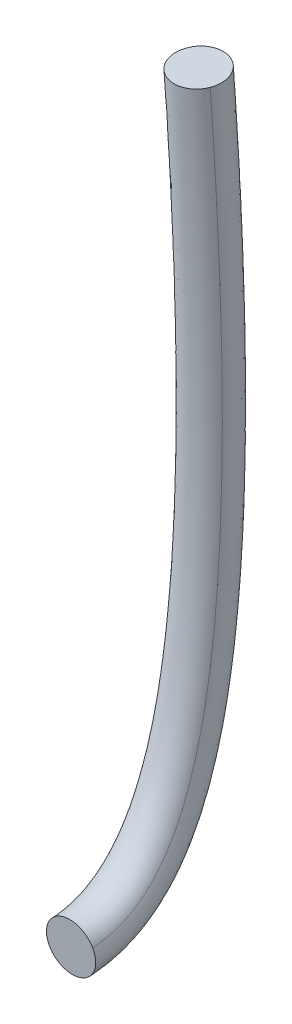
ISO-10303-21;
HEADER;
FILE_DESCRIPTION(('STEP AP214'),'2;1');
FILE_NAME('part.step','',(''),(''),'','','');
FILE_SCHEMA(('AUTOMOTIVE_DESIGN { 1 0 10303 214 1 1 1 1 }'));
ENDSEC;
DATA;
#1=APPLICATION_CONTEXT('core data for automotive mechanical design processes');
#2=APPLICATION_PROTOCOL_DEFINITION('international standard','automotive_design',2000,#1);
#3=PRODUCT_CONTEXT('',#1,'mechanical');
#4=PRODUCT('Part','Part','',(#3));
#5=PRODUCT_RELATED_PRODUCT_CATEGORY('part','',(#4));
#6=PRODUCT_DEFINITION_FORMATION('','',#4);
#7=PRODUCT_DEFINITION_CONTEXT('part definition',#1,'design');
#8=PRODUCT_DEFINITION('design','',#6,#7);
#9=PRODUCT_DEFINITION_SHAPE('','',#8);
#10=(LENGTH_UNIT() NAMED_UNIT(*) SI_UNIT(.MILLI.,.METRE.));
#11=(NAMED_UNIT(*) PLANE_ANGLE_UNIT() SI_UNIT($,.RADIAN.));
#12=(NAMED_UNIT(*) SI_UNIT($,.STERADIAN.) SOLID_ANGLE_UNIT());
#13=UNCERTAINTY_MEASURE_WITH_UNIT(LENGTH_MEASURE(1.E-05),#10,'distance_accuracy_value','');
#14=(GEOMETRIC_REPRESENTATION_CONTEXT(3) GLOBAL_UNCERTAINTY_ASSIGNED_CONTEXT((#13)) GLOBAL_UNIT_ASSIGNED_CONTEXT((#10,
#11,#12)) REPRESENTATION_CONTEXT('',''));
#15=CARTESIAN_POINT('',(0.,0.,0.));
#16=DIRECTION('',(0.,0.,1.));
#17=DIRECTION('',(1.,0.,0.));
#18=AXIS2_PLACEMENT_3D('',#15,#16,#17);
#19=CARTESIAN_POINT('',(2.74287605735283,-7.28809495488645,11.1726740101474));
#20=CARTESIAN_POINT('',(2.74287605735293,-7.28391227196276,11.0968550295844));
#21=CARTESIAN_POINT('',(2.74287605735307,-7.25716087085845,10.9541601878726));
#22=CARTESIAN_POINT('',(2.74287605735321,-7.13144865063385,10.6996029535221));
#23=CARTESIAN_POINT('',(2.7428760573531,-6.82482429921507,10.4240605016951));
#24=CARTESIAN_POINT('',(2.74287605735272,-6.16587122921789,10.1770932302241));
#25=CARTESIAN_POINT('',(2.74287605735222,-5.06029404172376,10.0061294862398));
#26=CARTESIAN_POINT('',(2.74287605735193,-3.38304927418693,9.96226684328779));
#27=CARTESIAN_POINT('',(2.74287605735239,-1.84087281979093,10.0365898659036));
#28=CARTESIAN_POINT('',(2.74287605735284,-1.0071197427742,10.097483370663));
#29=CARTESIAN_POINT('',(2.71375298184655,-7.22774566346305,11.1760032813776));
#30=CARTESIAN_POINT('',(2.71375298184665,-7.22383959943697,11.1051985376584));
#31=CARTESIAN_POINT('',(2.71375298184679,-7.19892516458884,10.9732427536788));
#32=CARTESIAN_POINT('',(2.71375298184693,-7.08368767800574,10.7396382142415));
#33=CARTESIAN_POINT('',(2.71375298184683,-6.79660405759646,10.4790045068828));
#34=CARTESIAN_POINT('',(2.71375298184644,-6.15267979847719,10.2363565523745));
#35=CARTESIAN_POINT('',(2.71375298184594,-5.05654346644841,10.0666567173344));
#36=CARTESIAN_POINT('',(2.71375298184565,-3.38434558742928,10.0227007328809));
#37=CARTESIAN_POINT('',(2.71375298184611,-1.84433494757116,10.0969390491669));
#38=CARTESIAN_POINT('',(2.71375298184656,-1.01152235391902,10.1577638653303));
#39=CARTESIAN_POINT('',(2.61201654344571,-7.14685068979496,11.1804659900879));
#40=CARTESIAN_POINT('',(2.6120165434458,-7.14331541171522,11.1163824377601));
#41=CARTESIAN_POINT('',(2.61201654344595,-7.12086343470429,10.9988217356804));
#42=CARTESIAN_POINT('',(2.61201654344609,-7.01966659159559,10.7933027869987));
#43=CARTESIAN_POINT('',(2.61201654344598,-6.75877621273556,10.5526535158968));
#44=CARTESIAN_POINT('',(2.6120165434456,-6.13499718862752,10.3157955440014));
#45=CARTESIAN_POINT('',(2.6120165434451,-5.05151588015773,10.1477900450127));
#46=CARTESIAN_POINT('',(2.61201654344481,-3.3860830857693,10.1037090252011));
#47=CARTESIAN_POINT('',(2.61201654344527,-1.84897576638812,10.1778338761681));
#48=CARTESIAN_POINT('',(2.61201654344571,-1.01742381695577,10.2385666206535));
#49=CARTESIAN_POINT('',(2.43452528876107,-7.16764514411101,11.1793188286734));
#50=CARTESIAN_POINT('',(2.43452528876116,-7.16401424203855,11.1135019119532));
#51=CARTESIAN_POINT('',(2.43452528876131,-7.14093403547936,10.9922387510038));
#52=CARTESIAN_POINT('',(2.43452528876145,-7.0361200440977,10.7794833584237));
#53=CARTESIAN_POINT('',(2.43452528876134,-6.7684940098246,10.5337000924034));
#54=CARTESIAN_POINT('',(2.43452528876096,-6.13953304957484,10.2953616309002));
#55=CARTESIAN_POINT('',(2.43452528876046,-5.0528017121965,10.1269267608778));
#56=CARTESIAN_POINT('',(2.43452528876017,-3.38563003354926,10.0828817367743));
#57=CARTESIAN_POINT('',(2.43452528876063,-1.84778388039093,10.1570393821722));
#58=CARTESIAN_POINT('',(2.43452528876108,-1.01590681660384,10.2177958715205));
#59=CARTESIAN_POINT('',(2.33405926185312,-7.26777318936752,11.1737950948804));
#60=CARTESIAN_POINT('',(2.33405926185321,-7.26368423802673,11.09967517523));
#61=CARTESIAN_POINT('',(2.33405926185336,-7.23754249192168,10.9606005539792));
#62=CARTESIAN_POINT('',(2.3340592618535,-7.11537235533315,10.7131305250554));
#63=CARTESIAN_POINT('',(2.33405926185339,-6.81533285191102,10.4426025636238));
#64=CARTESIAN_POINT('',(2.33405926185301,-6.16144708716404,10.1970750390796));
#65=CARTESIAN_POINT('',(2.33405926185251,-5.05904333594246,10.0265253402023));
#66=CARTESIAN_POINT('',(2.33405926185222,-3.38349782207332,9.98262404057894));
#67=CARTESIAN_POINT('',(2.33405926185268,-1.8420366561696,10.0569117400428));
#68=CARTESIAN_POINT('',(2.33405926185312,-1.00860225945721,10.1177819698528));
#69=CARTESIAN_POINT('',(2.31500000000068,-7.35208061372048,11.1691441325282));
#70=CARTESIAN_POINT('',(2.31500000000077,-7.34760369485504,11.0879915731232));
#71=CARTESIAN_POINT('',(2.31500000000092,-7.31891913266023,10.9339040945914));
#72=CARTESIAN_POINT('',(2.31500000000105,-7.18207685997886,10.6570801619975));
#73=CARTESIAN_POINT('',(2.31500000000094,-6.85472656792234,10.3657400882673));
#74=CARTESIAN_POINT('',(2.31500000000056,-6.17982844834647,10.1142171632709));
#75=CARTESIAN_POINT('',(2.31500000000007,-5.06425070540274,9.94193213737854));
#76=CARTESIAN_POINT('',(2.31499999999978,-3.38165529554353,9.89818020262244));
#77=CARTESIAN_POINT('',(2.31500000000023,-1.83720530777411,9.97260408602737));
#78=CARTESIAN_POINT('',(2.31500000000068,-1.00245185077312,10.0335706539573));
#79=CARTESIAN_POINT('',(2.315,-7.38568943191456,11.1672900449514));
#80=CARTESIAN_POINT('',(2.31500000000009,-7.3810594674981,11.0833632476063));
#81=CARTESIAN_POINT('',(2.31500000000024,-7.35133654868749,10.9233020086195));
#82=CARTESIAN_POINT('',(2.31500000000037,-7.2086864203845,10.6348639242625));
#83=CARTESIAN_POINT('',(2.31500000000026,-6.87046203039657,10.3352110893052));
#84=CARTESIAN_POINT('',(2.31499999999988,-6.18720558950165,10.0812573886417));
#85=CARTESIAN_POINT('',(2.31499999999939,-5.06636048889751,9.9082486010761));
#86=CARTESIAN_POINT('',(2.3149999999991,-3.3809540733158,9.86453621851609));
#87=CARTESIAN_POINT('',(2.31499999999955,-1.83527381521949,9.93899557759439));
#88=CARTESIAN_POINT('',(2.315,-1.00000001490137,10.0000001490162));
#89=B_SPLINE_SURFACE_WITH_KNOTS('',3,3,((#19,#20,#21,#22,#23,#24,#25,#26,#27,#28),(#29,#30,#31,
#32,#33,#34,#35,#36,#37,#38),(#39,#40,#41,#42,#43,#44,#45,#46,#47,#48),(#49,#50,#51,#52,#53,#54,
#55,#56,#57,#58),(#59,#60,#61,#62,#63,#64,#65,#66,#67,#68),(#69,#70,#71,#72,#73,#74,#75,#76,#77,
#78),(#79,#80,#81,#82,#83,#84,#85,#86,#87,#88)),.UNSPECIFIED.,.F.,.F.,.F.,(4,1,1,1,4),(4,1,1,1,
1,1,1,4),(0.448798950512828,1.34639685153848,2.01959527730772,2.69279370307697,
3.14159265358979),(0.,0.0714285714285714,0.142857142857143,0.285714285714286,0.428571428571429,
0.571428571428571,0.785714285714286,1.),.UNSPECIFIED.);
#90=CARTESIAN_POINT('',(2.315,-7.38568943191456,11.1672900449514));
#91=CARTESIAN_POINT('',(2.31500000000009,-7.3810594674981,11.0833632476063));
#92=CARTESIAN_POINT('',(2.31500000000024,-7.35133654868749,10.9233020086195));
#93=CARTESIAN_POINT('',(2.31500000000037,-7.2086864203845,10.6348639242625));
#94=CARTESIAN_POINT('',(2.31500000000026,-6.87046203039657,10.3352110893052));
#95=CARTESIAN_POINT('',(2.31499999999988,-6.18720558950165,10.0812573886417));
#96=CARTESIAN_POINT('',(2.31499999999939,-5.06636048889751,9.9082486010761));
#97=CARTESIAN_POINT('',(2.3149999999991,-3.3809540733158,9.86453621851609));
#98=CARTESIAN_POINT('',(2.31499999999955,-1.83527381521949,9.93899557759439));
#99=CARTESIAN_POINT('',(2.315,-1.00000001490137,10.0000001490162));
#100=B_SPLINE_CURVE_WITH_KNOTS('',3,(#90,#91,#92,#93,#94,#95,#96,#97,#98,#99),.UNSPECIFIED.,.F.,
.F.,(4,1,1,1,1,1,1,4),(0.,0.0714285714285714,0.142857142857143,0.285714285714286,
0.428571428571429,0.571428571428571,0.785714285714286,1.),.UNSPECIFIED.);
#101=CARTESIAN_POINT('',(2.315,-7.38568943191456,11.1672900449514));
#102=VERTEX_POINT('',#101);
#103=CARTESIAN_POINT('',(2.315,-1.00000001490137,10.0000001490162));
#104=VERTEX_POINT('',#103);
#105=EDGE_CURVE('E11',#102,#104,#100,.T.);
#106=CARTESIAN_POINT('',(2.315,-7.38568943191456,11.1672900449514));
#107=CARTESIAN_POINT('',(2.31500896470411,-7.39838166282353,11.1665898564618));
#108=CARTESIAN_POINT('',(2.31613100551139,-7.41108389469456,11.165889116252));
#109=CARTESIAN_POINT('',(2.32051228064609,-7.43613079110765,11.164507361642));
#110=CARTESIAN_POINT('',(2.32377581095085,-7.44847468471064,11.1638263897719));
#111=CARTESIAN_POINT('',(2.33228061852872,-7.47243526517356,11.1625045636276));
#112=CARTESIAN_POINT('',(2.33751786725331,-7.48405337748824,11.1618636307158));
#113=CARTESIAN_POINT('',(2.34983606433673,-7.50626256508225,11.1606384231357));
#114=CARTESIAN_POINT('',(2.35691595280953,-7.51685422598549,11.1600541161605));
#115=CARTESIAN_POINT('',(2.37289496100922,-7.53686096123792,11.1589504106072));
#116=CARTESIAN_POINT('',(2.3818216779409,-7.54625421078487,11.1584322160313));
#117=CARTESIAN_POINT('',(2.40122545622583,-7.56327215581114,11.1574933921704));
#118=CARTESIAN_POINT('',(2.41170163586845,-7.57089785081041,11.1570727077453));
#119=CARTESIAN_POINT('',(2.43322713426298,-7.58383505178018,11.1563590050659));
#120=CARTESIAN_POINT('',(2.44421540104035,-7.58924889619143,11.1560603411377));
#121=CARTESIAN_POINT('',(2.46691929446208,-7.59828673864571,11.1555617531981));
#122=CARTESIAN_POINT('',(2.47863580639159,-7.60190850829943,11.1553619521196));
#123=CARTESIAN_POINT('',(2.50315491083756,-7.60743380892634,11.1550571395198));
#124=CARTESIAN_POINT('',(2.51598169604064,-7.60923087119134,11.1549580015258));
#125=CARTESIAN_POINT('',(2.5417442628634,-7.61065932694018,11.1548791983366));
#126=CARTESIAN_POINT('',(2.55467988211084,-7.61029351755997,11.1548993788328));
#127=CARTESIAN_POINT('',(2.58025398552993,-7.607270363485,11.1550661562655));
#128=CARTESIAN_POINT('',(2.59289314364588,-7.60461886819262,11.1552124305098));
#129=CARTESIAN_POINT('',(2.61749001072985,-7.59709053291747,11.1556277439203));
#130=CARTESIAN_POINT('',(2.62944733196087,-7.59221244066673,11.15589685217));
#131=CARTESIAN_POINT('',(2.65178992279654,-7.58083357136503,11.1565245868345));
#132=CARTESIAN_POINT('',(2.66222415088748,-7.5744275543554,11.1568779856505));
#133=CARTESIAN_POINT('',(2.68197588188152,-7.56007325918947,11.1576698647397));
#134=CARTESIAN_POINT('',(2.69129273830489,-7.55212409510955,11.1581083938864));
#135=CARTESIAN_POINT('',(2.70922251448865,-7.53420782772129,11.1590967752272));
#136=CARTESIAN_POINT('',(2.71772914454914,-7.52413366902927,11.1596525333134));
#137=CARTESIAN_POINT('',(2.73281061039976,-7.50266260680048,11.1608370209532));
#138=CARTESIAN_POINT('',(2.73938838420447,-7.49126775226711,11.16146563747));
#139=CARTESIAN_POINT('',(2.75513021216507,-7.4568167930145,11.1633661831896));
#140=CARTESIAN_POINT('',(2.7614225848679,-7.43237335938177,11.1647146467497));
#141=CARTESIAN_POINT('',(2.76492493850227,-7.39526665219774,11.1667617013176));
#142=CARTESIAN_POINT('',(2.76508784607549,-7.38275680710809,11.1674518281836));
#143=CARTESIAN_POINT('',(2.76342160852836,-7.35785564060767,11.1688255433553));
#144=CARTESIAN_POINT('',(2.76159355238563,-7.34546425814048,11.1695091350293));
#145=CARTESIAN_POINT('',(2.7557848398338,-7.32053527520921,11.1708843847417));
#146=CARTESIAN_POINT('',(2.75170126270715,-7.3080212651594,11.1715747413747));
#147=CARTESIAN_POINT('',(2.74127730051706,-7.28397088048399,11.1729015217211));
#148=CARTESIAN_POINT('',(2.734938276883,-7.27243392128198,11.1735379776835));
#149=CARTESIAN_POINT('',(2.72083725755737,-7.2514689821293,11.1746945441836));
#150=CARTESIAN_POINT('',(2.71321084157737,-7.24194891279311,11.1752197349887));
#151=CARTESIAN_POINT('',(2.69654904691985,-7.22421070217572,11.176198293525));
#152=CARTESIAN_POINT('',(2.68751186883148,-7.21599425101121,11.176651568018));
#153=CARTESIAN_POINT('',(2.6676970396013,-7.20061313947346,11.1775000931775));
#154=CARTESIAN_POINT('',(2.6568477955983,-7.19354023624107,11.1778902819054));
#155=CARTESIAN_POINT('',(2.63413175675102,-7.18130338431704,11.1785653486393));
#156=CARTESIAN_POINT('',(2.62226637097625,-7.17613684326487,11.1788503696574));
#157=CARTESIAN_POINT('',(2.59779822918427,-7.16798739539909,11.1792999477996));
#158=CARTESIAN_POINT('',(2.58519544182267,-7.16500458148112,11.179464499799));
#159=CARTESIAN_POINT('',(2.55965145093931,-7.16133307914383,11.1796670444654));
#160=CARTESIAN_POINT('',(2.54670993174335,-7.16064661347473,11.1797049145107));
#161=CARTESIAN_POINT('',(2.52153220492211,-7.16143909500405,11.1796611959202));
#162=CARTESIAN_POINT('',(2.50929231770947,-7.16281430619186,11.1795853300578));
#163=CARTESIAN_POINT('',(2.48519235967198,-7.16748799379907,11.1793274981376));
#164=CARTESIAN_POINT('',(2.47333204265383,-7.17078519578465,11.1791456023861));
#165=CARTESIAN_POINT('',(2.44975912516828,-7.17948603718426,11.1786656056824));
#166=CARTESIAN_POINT('',(2.43808075272045,-7.18498292605269,11.1783623604656));
#167=CARTESIAN_POINT('',(2.41585364168293,-7.19791998560312,11.1776486655878));
#168=CARTESIAN_POINT('',(2.40530554287644,-7.20536124877596,11.1772381556577));
#169=CARTESIAN_POINT('',(2.38584476278662,-7.22169799174513,11.1763369114661));
#170=CARTESIAN_POINT('',(2.37689883574048,-7.23055416945654,11.1758483453708));
#171=CARTESIAN_POINT('',(2.3605771048414,-7.24960785642885,11.1747972163456));
#172=CARTESIAN_POINT('',(2.35320085366327,-7.25980498220336,11.1742346745713));
#173=CARTESIAN_POINT('',(2.34015539251321,-7.28152384802917,11.1730365164249));
#174=CARTESIAN_POINT('',(2.33452420177907,-7.29306842348802,11.1723996402987));
#175=CARTESIAN_POINT('',(2.32535174436188,-7.3169487978667,11.1710822388594));
#176=CARTESIAN_POINT('',(2.32180877535467,-7.32928394319032,11.1704017496029));
#177=CARTESIAN_POINT('',(2.31789278038603,-7.34903922173863,11.169311916086));
#178=CARTESIAN_POINT('',(2.31681270377974,-7.35632789552673,11.1689098240087));
#179=CARTESIAN_POINT('',(2.31536387505372,-7.37097309067819,11.1681018969274));
#180=CARTESIAN_POINT('',(2.31499480163131,-7.37832957988485,11.1676960636973));
#181=CARTESIAN_POINT('',(2.315,-7.38568943191456,11.1672900449514));
#182=B_SPLINE_CURVE_WITH_KNOTS('',3,(#106,#107,#108,#109,#110,#111,#112,#113,#114,#115,#116,
#117,#118,#119,#120,#121,#122,#123,#124,#125,#126,#127,#128,#129,#130,#131,#132,#133,#134,#135,
#136,#137,#138,#139,#140,#141,#142,#143,#144,#145,#146,#147,#148,#149,#150,#151,#152,#153,#154,
#155,#156,#157,#158,#159,#160,#161,#162,#163,#164,#165,#166,#167,#168,#169,#170,#171,#172,#173,
#174,#175,#176,#177,#178,#179,#180,#181),.UNSPECIFIED.,.T.,.F.,(4,2,2,2,2,2,2,2,2,2,2,2,2,2,2,2,
2,2,2,2,2,2,2,2,2,2,2,2,2,2,2,2,2,2,2,2,2,4),(0.,0.0381078075710447,0.0762922967376633,
0.114399266145828,0.152484364689622,0.191186051482009,0.229865799489612,0.266466979749708,
0.303113558777578,0.341793167441405,0.380422764612928,0.418953795528113,0.457506523563608,
0.494105523550739,0.530725597564658,0.570111078224461,0.609436251926878,0.683601793868497,
0.721083150779048,0.758544017175621,0.797875280656622,0.837182843221715,0.873655816171898,
0.910175695921471,0.94887007908257,0.987511648178638,1.02615486098964,1.06483546769083,
1.10163401558086,1.13840819079796,1.1769421288077,1.21549776471737,1.25312562421717,
1.29074274615157,1.32912961533753,1.3674851480036,1.38959273945398,1.41169033812761),.UNSPECIFIED.);
#183=CARTESIAN_POINT('',(2.74287605735283,-7.28809495488645,11.1726740101474));
#184=VERTEX_POINT('',#183);
#185=EDGE_CURVE('E45',#184,#102,#182,.T.);
#186=CARTESIAN_POINT('',(2.74287605735283,-7.28809495488645,11.1726740101474));
#187=CARTESIAN_POINT('',(2.74287605735293,-7.28391227196276,11.0968550295844));
#188=CARTESIAN_POINT('',(2.74287605735307,-7.25716087085845,10.9541601878726));
#189=CARTESIAN_POINT('',(2.74287605735321,-7.13144865063385,10.6996029535221));
#190=CARTESIAN_POINT('',(2.7428760573531,-6.82482429921507,10.4240605016951));
#191=CARTESIAN_POINT('',(2.74287605735272,-6.16587122921789,10.1770932302241));
#192=CARTESIAN_POINT('',(2.74287605735222,-5.06029404172376,10.0061294862398));
#193=CARTESIAN_POINT('',(2.74287605735193,-3.38304927418693,9.96226684328779));
#194=CARTESIAN_POINT('',(2.74287605735239,-1.84087281979093,10.0365898659036));
#195=CARTESIAN_POINT('',(2.74287605735284,-1.0071197427742,10.097483370663));
#196=B_SPLINE_CURVE_WITH_KNOTS('',3,(#186,#187,#188,#189,#190,#191,#192,#193,#194,#195),
.UNSPECIFIED.,.F.,.F.,(4,1,1,1,1,1,1,4),(0.,0.0714285714285714,0.142857142857143,
0.285714285714286,0.428571428571429,0.571428571428571,0.785714285714286,1.),.UNSPECIFIED.);
#197=CARTESIAN_POINT('',(2.74287605735284,-1.00711974277419,10.097483370663));
#198=VERTEX_POINT('',#197);
#199=EDGE_CURVE('E29',#184,#198,#196,.T.);
#200=CARTESIAN_POINT('',(2.315,-1.00000001490137,10.0000001490162));
#201=CARTESIAN_POINT('',(2.31498688264654,-1.00091767570766,10.0125647488685));
#202=CARTESIAN_POINT('',(2.3160644899023,-1.00183518530814,10.0251272784127));
#203=CARTESIAN_POINT('',(2.32026710672092,-1.00364587816514,10.0499192615152));
#204=CARTESIAN_POINT('',(2.32339428631161,-1.00453903459206,10.0621483477231));
#205=CARTESIAN_POINT('',(2.33167943386356,-1.00627463903436,10.085912221226));
#206=CARTESIAN_POINT('',(2.33683805377311,-1.0071170706705,10.0974467842568));
#207=CARTESIAN_POINT('',(2.34906582527119,-1.00872462325738,10.1194573734168));
#208=CARTESIAN_POINT('',(2.35613498177814,-1.00948974400907,10.1299333968208));
#209=CARTESIAN_POINT('',(2.37182104233748,-1.01091686644703,10.1494735387231));
#210=CARTESIAN_POINT('',(2.38042083559858,-1.0115798706356,10.1585513834698));
#211=CARTESIAN_POINT('',(2.39897995654105,-1.01279546917028,10.175195342833));
#212=CARTESIAN_POINT('',(2.40893881064082,-1.0133481018122,10.1827619817952));
#213=CARTESIAN_POINT('',(2.43028976683374,-1.014338952735,10.1963286997728));
#214=CARTESIAN_POINT('',(2.44171490263472,-1.01477341470933,10.2022773474877));
#215=CARTESIAN_POINT('',(2.46543241312504,-1.01549134220434,10.2121072014335));
#216=CARTESIAN_POINT('',(2.47772534366353,-1.01577470993232,10.215987068688));
#217=CARTESIAN_POINT('',(2.50251044581548,-1.016183971731,10.2215906759248));
#218=CARTESIAN_POINT('',(2.51499251785176,-1.01631314705339,10.2233593427627));
#219=CARTESIAN_POINT('',(2.54007381789078,-1.0164210725651,10.2248370574685));
#220=CARTESIAN_POINT('',(2.55267295657383,-1.01639992932041,10.2245475644365));
#221=CARTESIAN_POINT('',(2.57787765452609,-1.01619851338773,10.2217897800996));
#222=CARTESIAN_POINT('',(2.59047884083512,-1.01601524280578,10.2192804416693));
#223=CARTESIAN_POINT('',(2.61502795897059,-1.01548781439569,10.2120588987221));
#224=CARTESIAN_POINT('',(2.62697575935624,-1.01514362432761,10.2073462527762));
#225=CARTESIAN_POINT('',(2.64942570920422,-1.01433304451268,10.196247804468));
#226=CARTESIAN_POINT('',(2.65996761323762,-1.0138724332794,10.1899411214386));
#227=CARTESIAN_POINT('',(2.67994330074826,-1.01283677759848,10.1757609372938));
#228=CARTESIAN_POINT('',(2.68937623847494,-1.0122616467016,10.1678862525167));
#229=CARTESIAN_POINT('',(2.70750194311374,-1.01096627142121,10.1501499909861));
#230=CARTESIAN_POINT('',(2.7160967051316,-1.0102386881272,10.1401879299654));
#231=CARTESIAN_POINT('',(2.73138782283397,-1.00868655101777,10.1189360888032));
#232=CARTESIAN_POINT('',(2.73808708835751,-1.00786214861635,10.1076483818204));
#233=CARTESIAN_POINT('',(2.75428709755926,-1.0053556693608,10.0733297003773));
#234=CARTESIAN_POINT('',(2.76089789690931,-1.00356842886585,10.0488588267114));
#235=CARTESIAN_POINT('',(2.76481210288298,-1.00085467538418,10.0117021492535));
#236=CARTESIAN_POINT('',(2.76510830950506,-0.999941829500551,9.99920347525982));
#237=CARTESIAN_POINT('',(2.76370552724439,-0.998123202873953,9.97430286308674));
#238=CARTESIAN_POINT('',(2.76200752336249,-0.997217418865277,9.96190088019339));
#239=CARTESIAN_POINT('',(2.75645918510344,-0.995394123455987,9.93693634310832));
#240=CARTESIAN_POINT('',(2.75250685644226,-0.99447823583845,9.92439602173344));
#241=CARTESIAN_POINT('',(2.74233068526897,-0.992716303383758,9.90027166542649));
#242=CARTESIAN_POINT('',(2.73610847098558,-0.991870209014768,9.88868695230518));
#243=CARTESIAN_POINT('',(2.72222864194319,-0.990333838927918,9.86765099301192));
#244=CARTESIAN_POINT('',(2.71471364506071,-0.989636636545166,9.85810490703414));
#245=CARTESIAN_POINT('',(2.6982702336978,-0.988335718904332,9.84029275957651));
#246=CARTESIAN_POINT('',(2.68933989762536,-0.98773213298526,9.83202846900471));
#247=CARTESIAN_POINT('',(2.66972808427917,-0.986599091179957,9.81651487530888));
#248=CARTESIAN_POINT('',(2.65897319914272,-0.986076362723699,9.80935768406875));
#249=CARTESIAN_POINT('',(2.63643261040645,-0.985168502700584,9.7969272764127));
#250=CARTESIAN_POINT('',(2.62464827721369,-0.984783191575814,9.79165160149218));
#251=CARTESIAN_POINT('',(2.6002711579328,-0.984169234862319,9.78324531413782));
#252=CARTESIAN_POINT('',(2.58767526479453,-0.983941235944165,9.78012355590905));
#253=CARTESIAN_POINT('',(2.56212302004406,-0.983655124556072,9.77620612249603));
#254=CARTESIAN_POINT('',(2.54916648111273,-0.983597102098995,9.7754116797667));
#255=CARTESIAN_POINT('',(2.52404650306987,-0.983639607225033,9.77599365940106));
#256=CARTESIAN_POINT('',(2.51187968351015,-0.983731346313943,9.77724974981611));
#257=CARTESIAN_POINT('',(2.4878851552278,-0.984051672112113,9.78163564648833));
#258=CARTESIAN_POINT('',(2.47605761548966,-0.984280325815305,9.78476637002553));
#259=CARTESIAN_POINT('',(2.45219543510568,-0.984891273710713,9.79313146068204));
#260=CARTESIAN_POINT('',(2.44020827038941,-0.985283530671971,9.79850223790578));
#261=CARTESIAN_POINT('',(2.41737707947704,-0.986214160282052,9.81124440645143));
#262=CARTESIAN_POINT('',(2.4065316743745,-0.986752353806092,9.81861334519912));
#263=CARTESIAN_POINT('',(2.37721422304343,-0.988518179744738,9.84279101103811));
#264=CARTESIAN_POINT('',(2.36074663890124,-0.98992839210871,9.86209962042696));
#265=CARTESIAN_POINT('',(2.33493477410315,-0.993049558328768,9.90483458781226));
#266=CARTESIAN_POINT('',(2.32556997057872,-0.994759628008447,9.92824883967682));
#267=CARTESIAN_POINT('',(2.31678995299575,-0.997670616390055,9.96810605482529));
#268=CARTESIAN_POINT('',(2.31501664686398,-0.998835437407463,9.98405476908113));
#269=CARTESIAN_POINT('',(2.315,-1.00000001490137,10.0000001490162));
#270=B_SPLINE_CURVE_WITH_KNOTS('',3,(#200,#201,#202,#203,#204,#205,#206,#207,#208,#209,#210,
#211,#212,#213,#214,#215,#216,#217,#218,#219,#220,#221,#222,#223,#224,#225,#226,#227,#228,#229,
#230,#231,#232,#233,#234,#235,#236,#237,#238,#239,#240,#241,#242,#243,#244,#245,#246,#247,#248,
#249,#250,#251,#252,#253,#254,#255,#256,#257,#258,#259,#260,#261,#262,#263,#264,#265,#266,#267,
#268,#269),.UNSPECIFIED.,.T.,.F.,(4,2,2,2,2,2,2,2,2,2,2,2,2,2,2,2,2,2,2,2,2,2,2,2,2,2,2,2,2,2,2,
2,2,2,4),(0.,0.0377493665153731,0.0755387656731528,0.113340302444917,0.151141936532958,
0.188544869422885,0.225934801920168,0.264402279600388,0.30289462445161,0.34055234604032,
0.378183373440973,0.416525128160708,0.454874567880505,0.491603445576554,0.528360155206751,
0.567689326900412,0.60695779139232,0.681503615588599,0.719001452368627,0.756480775620069,
0.795808044237827,0.835107158009147,0.871459454031314,0.907861534815831,0.946474167802354,
0.985036160688742,1.02375574255462,1.06249582508774,1.09904310670353,1.13560828596435,
1.17483224171949,1.21400826962426,1.28871651232596,1.36320806093217,1.41111471920014),.UNSPECIFIED.);
#271=EDGE_CURVE('E48',#104,#198,#270,.T.);
#272=ORIENTED_EDGE('',*,*,#105,.F.);
#273=ORIENTED_EDGE('',*,*,#185,.F.);
#274=ORIENTED_EDGE('',*,*,#199,.T.);
#275=ORIENTED_EDGE('',*,*,#271,.F.);
#276=EDGE_LOOP('',(#272,#273,#274,#275));
#277=FACE_BOUND('',#276,.T.);
#278=ADVANCED_FACE('F17',(#277),#89,.F.);
#279=CARTESIAN_POINT('',(2.54,-1.00000001490116,10.0000001490116));
#280=DIRECTION('',(-5.32623886368089E-13,-0.997343536648528,-0.0728414024124084));
#281=DIRECTION('',(0.,0.0728414024124084,-0.997343536648528));
#282=AXIS2_PLACEMENT_3D('',#279,#280,#281);
#283=PLANE('',#282);
#284=ORIENTED_EDGE('',*,*,#271,.T.);
#285=EDGE_CURVE('E80',#198,#104,#270,.T.);
#286=ORIENTED_EDGE('',*,*,#285,.T.);
#287=EDGE_LOOP('',(#284,#286));
#288=FACE_BOUND('',#287,.T.);
#289=ADVANCED_FACE('F72',(#288),#283,.F.);
#290=CARTESIAN_POINT('',(2.54,-7.38568943191911,11.1672900449514));
#291=DIRECTION('',(-1.11249196396045E-12,-0.0550829445172842,0.998481782118886));
#292=DIRECTION('',(0.,-0.998481782118886,-0.0550829445172842));
#293=AXIS2_PLACEMENT_3D('',#290,#291,#292);
#294=PLANE('',#293);
#295=EDGE_CURVE('E52',#102,#184,#182,.T.);
#296=ORIENTED_EDGE('',*,*,#295,.T.);
#297=ORIENTED_EDGE('',*,*,#185,.T.);
#298=EDGE_LOOP('',(#296,#297));
#299=FACE_BOUND('',#298,.T.);
#300=ADVANCED_FACE('F51',(#299),#294,.T.);
#301=CARTESIAN_POINT('',(2.315,-7.38568943191456,11.1672900449514));
#302=CARTESIAN_POINT('',(2.31500000000009,-7.3810594674981,11.0833632476063));
#303=CARTESIAN_POINT('',(2.31500000000024,-7.35133654868749,10.9233020086195));
#304=CARTESIAN_POINT('',(2.31500000000037,-7.2086864203845,10.6348639242625));
#305=CARTESIAN_POINT('',(2.31500000000026,-6.87046203039657,10.3352110893052));
#306=CARTESIAN_POINT('',(2.31499999999988,-6.18720558950165,10.0812573886417));
#307=CARTESIAN_POINT('',(2.31499999999939,-5.06636048889751,9.9082486010761));
#308=CARTESIAN_POINT('',(2.3149999999991,-3.3809540733158,9.86453621851609));
#309=CARTESIAN_POINT('',(2.31499999999955,-1.83527381521949,9.93899557759439));
#310=CARTESIAN_POINT('',(2.315,-1.00000001490137,10.0000001490162));
#311=CARTESIAN_POINT('',(2.31499999999898,-7.43610265920569,11.1645089135862));
#312=CARTESIAN_POINT('',(2.31499999999908,-7.43123996642441,11.0763634777044));
#313=CARTESIAN_POINT('',(2.31499999999922,-7.40000775564094,10.9073199820426));
#314=CARTESIAN_POINT('',(2.31499999999935,-7.2485654175184,10.6012892606301));
#315=CARTESIAN_POINT('',(2.31499999999924,-6.89400399475515,10.2891987555438));
#316=CARTESIAN_POINT('',(2.31499999999886,-6.19817454427532,10.0316785363229));
#317=CARTESIAN_POINT('',(2.31499999999837,-5.06945890655458,9.85764663714189));
#318=CARTESIAN_POINT('',(2.31499999999808,-3.37983714153289,9.81403267193646));
#319=CARTESIAN_POINT('',(2.31499999999853,-1.83238732027909,9.8885820302603));
#320=CARTESIAN_POINT('',(2.31499999999898,-0.996322261093759,9.94964439160444));
#321=CARTESIAN_POINT('',(2.33867785236763,-7.50284575334779,11.1608269173622));
#322=CARTESIAN_POINT('',(2.33867785236772,-7.49767964542031,11.0671815123239));
#323=CARTESIAN_POINT('',(2.33867785236787,-7.46437752000619,10.8862783656512));
#324=CARTESIAN_POINT('',(2.338677852368,-7.30141458285151,10.5572112636183));
#325=CARTESIAN_POINT('',(2.33867785236789,-6.92526272070842,10.2286074795318));
#326=CARTESIAN_POINT('',(2.33867785236751,-6.21284043376801,9.96624705010055));
#327=CARTESIAN_POINT('',(2.33867785236701,-5.07365948284478,9.79076765560223));
#328=CARTESIAN_POINT('',(2.33867785236672,-3.37845520767037,9.74722586566046));
#329=CARTESIAN_POINT('',(2.33867785236718,-1.82854985600372,9.82183967915327));
#330=CARTESIAN_POINT('',(2.33867785236762,-0.991453208231999,9.88297738300135));
#331=CARTESIAN_POINT('',(2.43415466781238,-7.59922941936657,11.1555097486139));
#332=CARTESIAN_POINT('',(2.43415466781247,-7.59362018818649,11.0538319027021));
#333=CARTESIAN_POINT('',(2.43415466781261,-7.55740464687162,10.8557683009774));
#334=CARTESIAN_POINT('',(2.43415466781274,-7.37767854071038,10.4931652427286));
#335=CARTESIAN_POINT('',(2.43415466781263,-6.97030729312763,10.1407640554215));
#336=CARTESIAN_POINT('',(2.43415466781225,-6.23386751784578,9.87153893229905));
#337=CARTESIAN_POINT('',(2.43415466781176,-5.07962150115115,9.69406739092219));
#338=CARTESIAN_POINT('',(2.43415466781147,-3.37635734607784,9.65069120332708));
#339=CARTESIAN_POINT('',(2.43415466781193,-1.82302504500821,9.7254558541106));
#340=CARTESIAN_POINT('',(2.43415466781237,-0.984421811637552,9.78670359206814));
#341=CARTESIAN_POINT('',(2.59709957020476,-7.63627363374357,11.1534661415681));
#342=CARTESIAN_POINT('',(2.59709957020485,-7.63049558134208,11.0487280940731));
#343=CARTESIAN_POINT('',(2.597099570205,-7.59313755768761,10.8440792098327));
#344=CARTESIAN_POINT('',(2.59709957020512,-7.40700657933009,10.4686676857875));
#345=CARTESIAN_POINT('',(2.59709957020501,-6.98764863534685,10.1071053434471));
#346=CARTESIAN_POINT('',(2.59709957020463,-6.24199469355441,9.83520429958007));
#347=CARTESIAN_POINT('',(2.59709957020413,-5.0819441771834,9.65693762370356));
#348=CARTESIAN_POINT('',(2.59709957020384,-3.37558173185831,9.61360666151704));
#349=CARTESIAN_POINT('',(2.5970995702043,-1.82089656897085,9.68841194843048));
#350=CARTESIAN_POINT('',(2.59709957020475,-0.981719356194979,9.74970160721399));
#351=CARTESIAN_POINT('',(2.77222121956898,-7.49739001352567,11.1611278925224));
#352=CARTESIAN_POINT('',(2.77222121956907,-7.49224799148113,11.0679190893304));
#353=CARTESIAN_POINT('',(2.77222121956922,-7.45912599662415,10.8879804811288));
#354=CARTESIAN_POINT('',(2.77222121956935,-7.29708655787709,10.5607575902193));
#355=CARTESIAN_POINT('',(2.77222121956924,-6.92269368460993,10.2335107717728));
#356=CARTESIAN_POINT('',(2.77222121956886,-6.21161968595034,9.97156403847445));
#357=CARTESIAN_POINT('',(2.77222121956836,-5.07330110519689,9.79621713382761));
#358=CARTESIAN_POINT('',(2.77222121956807,-3.37855342036381,9.7526783008313));
#359=CARTESIAN_POINT('',(2.77222121956853,-1.82886597382346,9.82729518044557));
#360=CARTESIAN_POINT('',(2.77222121956898,-0.991851216234934,9.88842690340987));
#361=CARTESIAN_POINT('',(2.77199913285911,-7.34844424630986,11.1693447389172));
#362=CARTESIAN_POINT('',(2.77199913285921,-7.34398494448854,11.0885115215103));
#363=CARTESIAN_POINT('',(2.77199913285935,-7.31539657712806,10.9350776220663));
#364=CARTESIAN_POINT('',(2.77199913285949,-7.17920962326196,10.6595676928028));
#365=CARTESIAN_POINT('',(2.77199913285938,-6.85304454083368,10.3691164965075));
#366=CARTESIAN_POINT('',(2.771999132859,-6.17906265995859,10.1178299080737));
#367=CARTESIAN_POINT('',(2.7719991328585,-5.06404461699912,9.94560225514514));
#368=CARTESIAN_POINT('',(2.77199913285821,-3.38175296094459,9.90183295369473));
#369=CARTESIAN_POINT('',(2.77199913285867,-1.83741069201071,9.97624068264032));
#370=CARTESIAN_POINT('',(2.77199913285912,-1.00271713162937,10.0372028759956));
#371=CARTESIAN_POINT('',(2.74287605735283,-7.28809495488645,11.1726740101474));
#372=CARTESIAN_POINT('',(2.74287605735293,-7.28391227196276,11.0968550295844));
#373=CARTESIAN_POINT('',(2.74287605735307,-7.25716087085845,10.9541601878726));
#374=CARTESIAN_POINT('',(2.74287605735321,-7.13144865063385,10.6996029535221));
#375=CARTESIAN_POINT('',(2.7428760573531,-6.82482429921507,10.4240605016951));
#376=CARTESIAN_POINT('',(2.74287605735272,-6.16587122921789,10.1770932302241));
#377=CARTESIAN_POINT('',(2.74287605735222,-5.06029404172376,10.0061294862398));
#378=CARTESIAN_POINT('',(2.74287605735193,-3.38304927418693,9.96226684328779));
#379=CARTESIAN_POINT('',(2.74287605735239,-1.84087281979093,10.0365898659036));
#380=CARTESIAN_POINT('',(2.74287605735284,-1.0071197427742,10.097483370663));
#381=B_SPLINE_SURFACE_WITH_KNOTS('',3,3,((#301,#302,#303,#304,#305,#306,#307,#308,#309,#310),
(#311,#312,#313,#314,#315,#316,#317,#318,#319,#320),(#321,#322,#323,#324,#325,#326,#327,#328,
#329,#330),(#331,#332,#333,#334,#335,#336,#337,#338,#339,#340),(#341,#342,#343,#344,#345,#346,
#347,#348,#349,#350),(#351,#352,#353,#354,#355,#356,#357,#358,#359,#360),(#361,#362,#363,#364,
#365,#366,#367,#368,#369,#370),(#371,#372,#373,#374,#375,#376,#377,#378,#379,#380)),
.UNSPECIFIED.,.F.,.F.,.F.,(4,1,1,1,1,4),(4,1,1,1,1,1,1,4),(-3.14159265358979,-2.46839422782055,
-2.24399475256414,-1.34639685153848,-0.448798950512828,0.448798950512828),(0.,
0.0714285714285714,0.142857142857143,0.285714285714286,0.428571428571429,0.571428571428571,
0.785714285714286,1.),.UNSPECIFIED.);
#382=ORIENTED_EDGE('',*,*,#295,.F.);
#383=ORIENTED_EDGE('',*,*,#105,.T.);
#384=ORIENTED_EDGE('',*,*,#285,.F.);
#385=ORIENTED_EDGE('',*,*,#199,.F.);
#386=EDGE_LOOP('',(#382,#383,#384,#385));
#387=FACE_BOUND('',#386,.T.);
#388=ADVANCED_FACE('F54',(#387),#381,.F.);
#389=CLOSED_SHELL('',(#278,#289,#300,#388));
#390=MANIFOLD_SOLID_BREP('B1',#389);
#391=ADVANCED_BREP_SHAPE_REPRESENTATION('',(#18,#390),#14);
#392=SHAPE_DEFINITION_REPRESENTATION(#9,#391);
ENDSEC;
END-ISO-10303-21;
